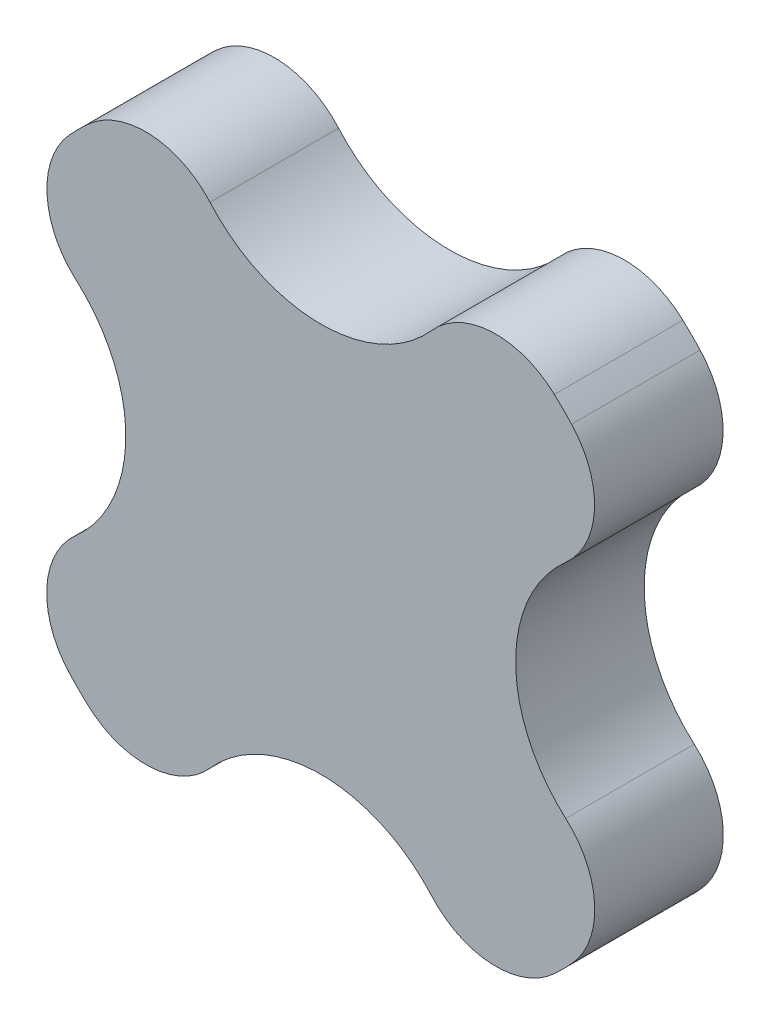
ISO-10303-21;
HEADER;
FILE_DESCRIPTION(('STEP AP214'),'2;1');
FILE_NAME('part.step','',(''),(''),'','','');
FILE_SCHEMA(('AUTOMOTIVE_DESIGN { 1 0 10303 214 1 1 1 1 }'));
ENDSEC;
DATA;
#1=APPLICATION_CONTEXT('core data for automotive mechanical design processes');
#2=APPLICATION_PROTOCOL_DEFINITION('international standard','automotive_design',2000,#1);
#3=PRODUCT_CONTEXT('',#1,'mechanical');
#4=PRODUCT('Part','Part','',(#3));
#5=PRODUCT_RELATED_PRODUCT_CATEGORY('part','',(#4));
#6=PRODUCT_DEFINITION_FORMATION('','',#4);
#7=PRODUCT_DEFINITION_CONTEXT('part definition',#1,'design');
#8=PRODUCT_DEFINITION('design','',#6,#7);
#9=PRODUCT_DEFINITION_SHAPE('','',#8);
#10=(LENGTH_UNIT() NAMED_UNIT(*) SI_UNIT(.MILLI.,.METRE.));
#11=(NAMED_UNIT(*) PLANE_ANGLE_UNIT() SI_UNIT($,.RADIAN.));
#12=(NAMED_UNIT(*) SI_UNIT($,.STERADIAN.) SOLID_ANGLE_UNIT());
#13=UNCERTAINTY_MEASURE_WITH_UNIT(LENGTH_MEASURE(1.E-05),#10,'distance_accuracy_value','');
#14=(GEOMETRIC_REPRESENTATION_CONTEXT(3) GLOBAL_UNCERTAINTY_ASSIGNED_CONTEXT((#13)) GLOBAL_UNIT_ASSIGNED_CONTEXT((#10,
#11,#12)) REPRESENTATION_CONTEXT('',''));
#15=CARTESIAN_POINT('',(0.,0.,0.));
#16=DIRECTION('',(0.,0.,1.));
#17=DIRECTION('',(1.,0.,0.));
#18=AXIS2_PLACEMENT_3D('',#15,#16,#17);
#19=CARTESIAN_POINT('',(-39.99999326808,0.023206827717899,15.));
#20=DIRECTION('',(0.,0.,-1.));
#21=DIRECTION('',(-1.,0.,0.));
#22=AXIS2_PLACEMENT_3D('',#19,#20,#21);
#23=CYLINDRICAL_SURFACE('',#22,17.252919273043);
#24=CARTESIAN_POINT('',(-39.99999326808,0.023206827717899,15.));
#25=DIRECTION('',(0.,0.,-1.));
#26=DIRECTION('',(0.,1.,0.));
#27=AXIS2_PLACEMENT_3D('',#24,#25,#26);
#28=CIRCLE('',#27,17.252919273043);
#29=CARTESIAN_POINT('',(-28.5757505394532,12.9518533740333,15.));
#30=VERTEX_POINT('',#29);
#31=CARTESIAN_POINT('',(-28.5907598713349,-12.9186870344931,15.));
#32=VERTEX_POINT('',#31);
#33=EDGE_CURVE('E165',#30,#32,#28,.T.);
#34=ORIENTED_EDGE('',*,*,#33,.F.);
#35=DIRECTION('',(0.,0.,-1.));
#36=VECTOR('',#35,1.);
#37=CARTESIAN_POINT('',(-28.5757505394532,12.9518533740333,15.));
#38=LINE('',#37,#36);
#39=CARTESIAN_POINT('',(-28.5757505394532,12.9518533740333,0.));
#40=VERTEX_POINT('',#39);
#41=EDGE_CURVE('E230',#30,#40,#38,.T.);
#42=ORIENTED_EDGE('',*,*,#41,.T.);
#43=CARTESIAN_POINT('',(-39.99999326808,0.023206827717899,0.));
#44=DIRECTION('',(0.,0.,-1.));
#45=DIRECTION('',(0.,1.,0.));
#46=AXIS2_PLACEMENT_3D('',#43,#44,#45);
#47=CIRCLE('',#46,17.252919273043);
#48=CARTESIAN_POINT('',(-28.5907598713349,-12.9186870344931,0.));
#49=VERTEX_POINT('',#48);
#50=EDGE_CURVE('E286',#40,#49,#47,.T.);
#51=ORIENTED_EDGE('',*,*,#50,.T.);
#52=DIRECTION('',(0.,0.,-1.));
#53=VECTOR('',#52,1.);
#54=CARTESIAN_POINT('',(-28.5907598713349,-12.9186870344931,15.));
#55=LINE('',#54,#53);
#56=EDGE_CURVE('E227',#49,#32,#55,.F.);
#57=ORIENTED_EDGE('',*,*,#56,.T.);
#58=EDGE_LOOP('',(#34,#42,#51,#57));
#59=FACE_BOUND('',#58,.T.);
#60=ADVANCED_FACE('F14',(#59),#23,.F.);
#61=CARTESIAN_POINT('',(0.,0.,15.));
#62=DIRECTION('',(0.,0.,-1.));
#63=DIRECTION('',(-1.,0.,0.));
#64=AXIS2_PLACEMENT_3D('',#61,#62,#63);
#65=CYLINDRICAL_SURFACE('',#64,40.0000000000413);
#66=CARTESIAN_POINT('',(0.,0.,15.));
#67=DIRECTION('',(0.,0.,1.));
#68=DIRECTION('',(1.,0.,0.));
#69=AXIS2_PLACEMENT_3D('',#66,#67,#68);
#70=CIRCLE('',#69,40.0000000000413);
#71=CARTESIAN_POINT('',(-29.3037742035903,-27.2266196474755,15.));
#72=VERTEX_POINT('',#71);
#73=CARTESIAN_POINT('',(-27.2266196474755,-29.3037742035903,15.));
#74=VERTEX_POINT('',#73);
#75=EDGE_CURVE('E308',#72,#74,#70,.T.);
#76=ORIENTED_EDGE('',*,*,#75,.F.);
#77=DIRECTION('',(0.,0.,-1.));
#78=VECTOR('',#77,1.);
#79=CARTESIAN_POINT('',(-29.3037742035904,-27.2266196474755,15.));
#80=LINE('',#79,#78);
#81=CARTESIAN_POINT('',(-29.3037742035903,-27.2266196474755,0.));
#82=VERTEX_POINT('',#81);
#83=EDGE_CURVE('E237',#72,#82,#80,.T.);
#84=ORIENTED_EDGE('',*,*,#83,.T.);
#85=CARTESIAN_POINT('',(0.,0.,0.));
#86=DIRECTION('',(0.,0.,1.));
#87=DIRECTION('',(1.,0.,0.));
#88=AXIS2_PLACEMENT_3D('',#85,#86,#87);
#89=CIRCLE('',#88,40.0000000000413);
#90=CARTESIAN_POINT('',(-27.2266196474755,-29.3037742035903,0.));
#91=VERTEX_POINT('',#90);
#92=EDGE_CURVE('E282',#82,#91,#89,.T.);
#93=ORIENTED_EDGE('',*,*,#92,.T.);
#94=DIRECTION('',(0.,0.,-1.));
#95=VECTOR('',#94,1.);
#96=CARTESIAN_POINT('',(-27.2266196474755,-29.3037742035903,15.));
#97=LINE('',#96,#95);
#98=EDGE_CURVE('E234',#91,#74,#97,.F.);
#99=ORIENTED_EDGE('',*,*,#98,.T.);
#100=EDGE_LOOP('',(#76,#84,#93,#99));
#101=FACE_BOUND('',#100,.T.);
#102=ADVANCED_FACE('F329',(#101),#65,.T.);
#103=CARTESIAN_POINT('',(0.0232068277178459,-39.99999326808,15.));
#104=DIRECTION('',(0.,0.,-1.));
#105=DIRECTION('',(-1.,0.,0.));
#106=AXIS2_PLACEMENT_3D('',#103,#104,#105);
#107=CYLINDRICAL_SURFACE('',#106,17.252919273043);
#108=CARTESIAN_POINT('',(0.0232068277178459,-39.99999326808,15.));
#109=DIRECTION('',(0.,0.,-1.));
#110=DIRECTION('',(1.,0.,0.));
#111=AXIS2_PLACEMENT_3D('',#108,#109,#110);
#112=CIRCLE('',#111,17.252919273043);
#113=CARTESIAN_POINT('',(-12.9186870344931,-28.5907598713349,15.));
#114=VERTEX_POINT('',#113);
#115=CARTESIAN_POINT('',(12.9518533740333,-28.5757505394532,15.));
#116=VERTEX_POINT('',#115);
#117=EDGE_CURVE('E304',#114,#116,#112,.T.);
#118=ORIENTED_EDGE('',*,*,#117,.F.);
#119=DIRECTION('',(0.,0.,-1.));
#120=VECTOR('',#119,1.);
#121=CARTESIAN_POINT('',(-12.9186870344931,-28.5907598713349,15.));
#122=LINE('',#121,#120);
#123=CARTESIAN_POINT('',(-12.9186870344931,-28.5907598713349,0.));
#124=VERTEX_POINT('',#123);
#125=EDGE_CURVE('E244',#114,#124,#122,.T.);
#126=ORIENTED_EDGE('',*,*,#125,.T.);
#127=CARTESIAN_POINT('',(0.0232068277178459,-39.99999326808,0.));
#128=DIRECTION('',(0.,0.,-1.));
#129=DIRECTION('',(1.,0.,0.));
#130=AXIS2_PLACEMENT_3D('',#127,#128,#129);
#131=CIRCLE('',#130,17.252919273043);
#132=CARTESIAN_POINT('',(12.9518533740333,-28.5757505394532,0.));
#133=VERTEX_POINT('',#132);
#134=EDGE_CURVE('E276',#124,#133,#131,.T.);
#135=ORIENTED_EDGE('',*,*,#134,.T.);
#136=DIRECTION('',(0.,0.,-1.));
#137=VECTOR('',#136,1.);
#138=CARTESIAN_POINT('',(12.9518533740333,-28.5757505394532,15.));
#139=LINE('',#138,#137);
#140=EDGE_CURVE('E241',#133,#116,#139,.F.);
#141=ORIENTED_EDGE('',*,*,#140,.T.);
#142=EDGE_LOOP('',(#118,#126,#135,#141));
#143=FACE_BOUND('',#142,.T.);
#144=ADVANCED_FACE('F339',(#143),#107,.F.);
#145=CARTESIAN_POINT('',(0.,0.,15.));
#146=DIRECTION('',(0.,0.,-1.));
#147=DIRECTION('',(-1.,0.,0.));
#148=AXIS2_PLACEMENT_3D('',#145,#146,#147);
#149=CYLINDRICAL_SURFACE('',#148,40.0000000000413);
#150=CARTESIAN_POINT('',(0.,0.,15.));
#151=DIRECTION('',(0.,0.,1.));
#152=DIRECTION('',(1.,0.,0.));
#153=AXIS2_PLACEMENT_3D('',#150,#151,#152);
#154=CIRCLE('',#153,40.0000000000413);
#155=CARTESIAN_POINT('',(27.2606036948709,-29.2721623081469,15.));
#156=VERTEX_POINT('',#155);
#157=CARTESIAN_POINT('',(29.3037742035903,-27.2266196474755,15.));
#158=VERTEX_POINT('',#157);
#159=EDGE_CURVE('E300',#156,#158,#154,.T.);
#160=ORIENTED_EDGE('',*,*,#159,.F.);
#161=DIRECTION('',(0.,0.,-1.));
#162=VECTOR('',#161,1.);
#163=CARTESIAN_POINT('',(27.2606036948709,-29.2721623081469,15.));
#164=LINE('',#163,#162);
#165=CARTESIAN_POINT('',(27.2606036948709,-29.2721623081469,0.));
#166=VERTEX_POINT('',#165);
#167=EDGE_CURVE('E251',#156,#166,#164,.T.);
#168=ORIENTED_EDGE('',*,*,#167,.T.);
#169=CARTESIAN_POINT('',(0.,0.,0.));
#170=DIRECTION('',(0.,0.,1.));
#171=DIRECTION('',(1.,0.,0.));
#172=AXIS2_PLACEMENT_3D('',#169,#170,#171);
#173=CIRCLE('',#172,40.0000000000413);
#174=CARTESIAN_POINT('',(29.3037742035903,-27.2266196474755,0.));
#175=VERTEX_POINT('',#174);
#176=EDGE_CURVE('E272',#166,#175,#173,.T.);
#177=ORIENTED_EDGE('',*,*,#176,.T.);
#178=DIRECTION('',(0.,0.,-1.));
#179=VECTOR('',#178,1.);
#180=CARTESIAN_POINT('',(29.3037742035903,-27.2266196474755,15.));
#181=LINE('',#180,#179);
#182=EDGE_CURVE('E248',#175,#158,#181,.F.);
#183=ORIENTED_EDGE('',*,*,#182,.T.);
#184=EDGE_LOOP('',(#160,#168,#177,#183));
#185=FACE_BOUND('',#184,.T.);
#186=ADVANCED_FACE('F347',(#185),#149,.T.);
#187=CARTESIAN_POINT('',(39.99999326808,0.0232068277177949,15.));
#188=DIRECTION('',(0.,0.,-1.));
#189=DIRECTION('',(-1.,0.,0.));
#190=AXIS2_PLACEMENT_3D('',#187,#188,#189);
#191=CYLINDRICAL_SURFACE('',#190,17.252919273043);
#192=CARTESIAN_POINT('',(39.99999326808,0.0232068277177949,0.));
#193=DIRECTION('',(0.,0.,-1.));
#194=DIRECTION('',(0.,1.,0.));
#195=AXIS2_PLACEMENT_3D('',#192,#193,#194);
#196=CIRCLE('',#195,17.252919273043);
#197=CARTESIAN_POINT('',(28.5907598713349,-12.9186870344931,0.));
#198=VERTEX_POINT('',#197);
#199=CARTESIAN_POINT('',(28.5757505394532,12.9518533740332,0.));
#200=VERTEX_POINT('',#199);
#201=EDGE_CURVE('E167',#198,#200,#196,.T.);
#202=ORIENTED_EDGE('',*,*,#201,.T.);
#203=DIRECTION('',(0.,0.,-1.));
#204=VECTOR('',#203,1.);
#205=CARTESIAN_POINT('',(28.5757505394532,12.9518533740332,15.));
#206=LINE('',#205,#204);
#207=CARTESIAN_POINT('',(28.5757505394532,12.9518533740332,15.));
#208=VERTEX_POINT('',#207);
#209=EDGE_CURVE('E9',#200,#208,#206,.F.);
#210=ORIENTED_EDGE('',*,*,#209,.T.);
#211=CARTESIAN_POINT('',(39.99999326808,0.0232068277177949,15.));
#212=DIRECTION('',(0.,0.,-1.));
#213=DIRECTION('',(0.,1.,0.));
#214=AXIS2_PLACEMENT_3D('',#211,#212,#213);
#215=CIRCLE('',#214,17.252919273043);
#216=CARTESIAN_POINT('',(28.5907598713349,-12.9186870344931,15.));
#217=VERTEX_POINT('',#216);
#218=EDGE_CURVE('E266',#217,#208,#215,.T.);
#219=ORIENTED_EDGE('',*,*,#218,.F.);
#220=DIRECTION('',(0.,0.,-1.));
#221=VECTOR('',#220,1.);
#222=CARTESIAN_POINT('',(28.5907598713349,-12.9186870344931,15.));
#223=LINE('',#222,#221);
#224=EDGE_CURVE('E23',#217,#198,#223,.T.);
#225=ORIENTED_EDGE('',*,*,#224,.T.);
#226=EDGE_LOOP('',(#202,#210,#219,#225));
#227=FACE_BOUND('',#226,.T.);
#228=ADVANCED_FACE('F263',(#227),#191,.F.);
#229=CARTESIAN_POINT('',(0.,0.,15.));
#230=DIRECTION('',(0.,0.,-1.));
#231=DIRECTION('',(-1.,0.,0.));
#232=AXIS2_PLACEMENT_3D('',#229,#230,#231);
#233=CYLINDRICAL_SURFACE('',#232,40.0000000000413);
#234=CARTESIAN_POINT('',(0.,0.,0.));
#235=DIRECTION('',(0.,0.,1.));
#236=DIRECTION('',(1.,0.,0.));
#237=AXIS2_PLACEMENT_3D('',#234,#235,#236);
#238=CIRCLE('',#237,40.0000000000413);
#239=CARTESIAN_POINT('',(29.2721623081469,27.2606036948708,0.));
#240=VERTEX_POINT('',#239);
#241=CARTESIAN_POINT('',(27.2606036948709,29.2721623081469,0.));
#242=VERTEX_POINT('',#241);
#243=EDGE_CURVE('E158',#240,#242,#238,.T.);
#244=ORIENTED_EDGE('',*,*,#243,.T.);
#245=DIRECTION('',(0.,0.,-1.));
#246=VECTOR('',#245,1.);
#247=CARTESIAN_POINT('',(27.2606036948709,29.2721623081469,15.));
#248=LINE('',#247,#246);
#249=CARTESIAN_POINT('',(27.2606036948709,29.2721623081469,15.));
#250=VERTEX_POINT('',#249);
#251=EDGE_CURVE('E134',#242,#250,#248,.F.);
#252=ORIENTED_EDGE('',*,*,#251,.T.);
#253=CARTESIAN_POINT('',(0.,0.,15.));
#254=DIRECTION('',(0.,0.,1.));
#255=DIRECTION('',(1.,0.,0.));
#256=AXIS2_PLACEMENT_3D('',#253,#254,#255);
#257=CIRCLE('',#256,40.0000000000413);
#258=CARTESIAN_POINT('',(29.2721623081469,27.2606036948708,15.));
#259=VERTEX_POINT('',#258);
#260=EDGE_CURVE('E294',#259,#250,#257,.T.);
#261=ORIENTED_EDGE('',*,*,#260,.F.);
#262=DIRECTION('',(0.,0.,-1.));
#263=VECTOR('',#262,1.);
#264=CARTESIAN_POINT('',(29.2721623081469,27.2606036948708,15.));
#265=LINE('',#264,#263);
#266=EDGE_CURVE('E140',#259,#240,#265,.T.);
#267=ORIENTED_EDGE('',*,*,#266,.T.);
#268=EDGE_LOOP('',(#244,#252,#261,#267));
#269=FACE_BOUND('',#268,.T.);
#270=ADVANCED_FACE('F451',(#269),#233,.T.);
#271=CARTESIAN_POINT('',(0.0232068277178459,39.99999326808,15.));
#272=DIRECTION('',(0.,0.,-1.));
#273=DIRECTION('',(-1.,0.,0.));
#274=AXIS2_PLACEMENT_3D('',#271,#272,#273);
#275=CYLINDRICAL_SURFACE('',#274,17.252919273043);
#276=CARTESIAN_POINT('',(0.0232068277178459,39.99999326808,15.));
#277=DIRECTION('',(0.,0.,-1.));
#278=DIRECTION('',(1.,0.,0.));
#279=AXIS2_PLACEMENT_3D('',#276,#277,#278);
#280=CIRCLE('',#279,17.252919273043);
#281=CARTESIAN_POINT('',(12.9518533740333,28.5757505394532,15.));
#282=VERTEX_POINT('',#281);
#283=CARTESIAN_POINT('',(-12.9186870344931,28.5907598713349,15.));
#284=VERTEX_POINT('',#283);
#285=EDGE_CURVE('E149',#282,#284,#280,.T.);
#286=ORIENTED_EDGE('',*,*,#285,.F.);
#287=DIRECTION('',(0.,0.,-1.));
#288=VECTOR('',#287,1.);
#289=CARTESIAN_POINT('',(12.9518533740333,28.5757505394532,15.));
#290=LINE('',#289,#288);
#291=CARTESIAN_POINT('',(12.9518533740333,28.5757505394532,0.));
#292=VERTEX_POINT('',#291);
#293=EDGE_CURVE('E133',#282,#292,#290,.T.);
#294=ORIENTED_EDGE('',*,*,#293,.T.);
#295=CARTESIAN_POINT('',(0.0232068277178459,39.99999326808,0.));
#296=DIRECTION('',(0.,0.,-1.));
#297=DIRECTION('',(1.,0.,0.));
#298=AXIS2_PLACEMENT_3D('',#295,#296,#297);
#299=CIRCLE('',#298,17.252919273043);
#300=CARTESIAN_POINT('',(-12.9186870344931,28.5907598713349,0.));
#301=VERTEX_POINT('',#300);
#302=EDGE_CURVE('E147',#292,#301,#299,.T.);
#303=ORIENTED_EDGE('',*,*,#302,.T.);
#304=DIRECTION('',(0.,0.,-1.));
#305=VECTOR('',#304,1.);
#306=CARTESIAN_POINT('',(-12.9186870344931,28.5907598713349,15.));
#307=LINE('',#306,#305);
#308=EDGE_CURVE('E152',#301,#284,#307,.F.);
#309=ORIENTED_EDGE('',*,*,#308,.T.);
#310=EDGE_LOOP('',(#286,#294,#303,#309));
#311=FACE_BOUND('',#310,.T.);
#312=ADVANCED_FACE('F146',(#311),#275,.F.);
#313=CARTESIAN_POINT('',(0.,0.,15.));
#314=DIRECTION('',(0.,0.,-1.));
#315=DIRECTION('',(-1.,0.,0.));
#316=AXIS2_PLACEMENT_3D('',#313,#314,#315);
#317=CYLINDRICAL_SURFACE('',#316,40.0000000000413);
#318=CARTESIAN_POINT('',(0.,0.,15.));
#319=DIRECTION('',(0.,0.,1.));
#320=DIRECTION('',(1.,0.,0.));
#321=AXIS2_PLACEMENT_3D('',#318,#319,#320);
#322=CIRCLE('',#321,40.0000000000413);
#323=CARTESIAN_POINT('',(-27.2266196474755,29.3037742035903,15.));
#324=VERTEX_POINT('',#323);
#325=CARTESIAN_POINT('',(-29.2721623081468,27.260603694871,15.));
#326=VERTEX_POINT('',#325);
#327=EDGE_CURVE('E172',#324,#326,#322,.T.);
#328=ORIENTED_EDGE('',*,*,#327,.F.);
#329=DIRECTION('',(0.,0.,-1.));
#330=VECTOR('',#329,1.);
#331=CARTESIAN_POINT('',(-27.2266196474755,29.3037742035903,15.));
#332=LINE('',#331,#330);
#333=CARTESIAN_POINT('',(-27.2266196474755,29.3037742035903,0.));
#334=VERTEX_POINT('',#333);
#335=EDGE_CURVE('E223',#324,#334,#332,.T.);
#336=ORIENTED_EDGE('',*,*,#335,.T.);
#337=CARTESIAN_POINT('',(0.,0.,0.));
#338=DIRECTION('',(0.,0.,1.));
#339=DIRECTION('',(1.,0.,0.));
#340=AXIS2_PLACEMENT_3D('',#337,#338,#339);
#341=CIRCLE('',#340,40.0000000000413);
#342=CARTESIAN_POINT('',(-29.2721623081468,27.260603694871,0.));
#343=VERTEX_POINT('',#342);
#344=EDGE_CURVE('E157',#334,#343,#341,.T.);
#345=ORIENTED_EDGE('',*,*,#344,.T.);
#346=DIRECTION('',(0.,0.,-1.));
#347=VECTOR('',#346,1.);
#348=CARTESIAN_POINT('',(-29.2721623081468,27.260603694871,15.));
#349=LINE('',#348,#347);
#350=EDGE_CURVE('E30',#343,#326,#349,.F.);
#351=ORIENTED_EDGE('',*,*,#350,.T.);
#352=EDGE_LOOP('',(#328,#336,#345,#351));
#353=FACE_BOUND('',#352,.T.);
#354=ADVANCED_FACE('F418',(#353),#317,.T.);
#355=CARTESIAN_POINT('',(-19.99999663404,0.0116034138589495,15.));
#356=DIRECTION('',(0.,0.,-1.));
#357=DIRECTION('',(-1.,0.,0.));
#358=AXIS2_PLACEMENT_3D('',#355,#356,#357);
#359=PLANE('',#358);
#360=ORIENTED_EDGE('',*,*,#260,.T.);
#361=CARTESIAN_POINT('',(20.4454527711602,21.9541217311176,15.));
#362=DIRECTION('',(0.,0.,-1.));
#363=DIRECTION('',(-1.,0.,0.));
#364=AXIS2_PLACEMENT_3D('',#361,#362,#363);
#365=CIRCLE('',#364,10.);
#366=EDGE_CURVE('E218',#250,#282,#365,.F.);
#367=ORIENTED_EDGE('',*,*,#366,.T.);
#368=ORIENTED_EDGE('',*,*,#285,.T.);
#369=CARTESIAN_POINT('',(-20.4199647356136,21.9778306527003,15.));
#370=DIRECTION('',(0.,0.,-1.));
#371=DIRECTION('',(-1.,0.,0.));
#372=AXIS2_PLACEMENT_3D('',#369,#370,#371);
#373=CIRCLE('',#372,10.);
#374=EDGE_CURVE('E37',#284,#324,#373,.F.);
#375=ORIENTED_EDGE('',*,*,#374,.T.);
#376=ORIENTED_EDGE('',*,*,#327,.T.);
#377=CARTESIAN_POINT('',(-21.9541217311176,20.4454527711602,15.));
#378=DIRECTION('',(0.,0.,-1.));
#379=DIRECTION('',(-1.,0.,0.));
#380=AXIS2_PLACEMENT_3D('',#377,#378,#379);
#381=CIRCLE('',#380,10.);
#382=EDGE_CURVE('E213',#326,#30,#381,.F.);
#383=ORIENTED_EDGE('',*,*,#382,.T.);
#384=ORIENTED_EDGE('',*,*,#33,.T.);
#385=CARTESIAN_POINT('',(-21.9778306527003,-20.4199647356136,15.));
#386=DIRECTION('',(0.,0.,-1.));
#387=DIRECTION('',(-1.,0.,0.));
#388=AXIS2_PLACEMENT_3D('',#385,#386,#387);
#389=CIRCLE('',#388,10.);
#390=EDGE_CURVE('E210',#32,#72,#389,.F.);
#391=ORIENTED_EDGE('',*,*,#390,.T.);
#392=ORIENTED_EDGE('',*,*,#75,.T.);
#393=CARTESIAN_POINT('',(-20.4199647356136,-21.9778306527003,15.));
#394=DIRECTION('',(0.,0.,-1.));
#395=DIRECTION('',(-1.,0.,0.));
#396=AXIS2_PLACEMENT_3D('',#393,#394,#395);
#397=CIRCLE('',#396,10.);
#398=EDGE_CURVE('E207',#74,#114,#397,.F.);
#399=ORIENTED_EDGE('',*,*,#398,.T.);
#400=ORIENTED_EDGE('',*,*,#117,.T.);
#401=CARTESIAN_POINT('',(20.4454527711602,-21.9541217311176,15.));
#402=DIRECTION('',(0.,0.,-1.));
#403=DIRECTION('',(-1.,0.,0.));
#404=AXIS2_PLACEMENT_3D('',#401,#402,#403);
#405=CIRCLE('',#404,10.);
#406=EDGE_CURVE('E204',#116,#156,#405,.F.);
#407=ORIENTED_EDGE('',*,*,#406,.T.);
#408=ORIENTED_EDGE('',*,*,#159,.T.);
#409=CARTESIAN_POINT('',(21.9778306527003,-20.4199647356137,15.));
#410=DIRECTION('',(0.,0.,-1.));
#411=DIRECTION('',(-1.,0.,0.));
#412=AXIS2_PLACEMENT_3D('',#409,#410,#411);
#413=CIRCLE('',#412,10.);
#414=EDGE_CURVE('E198',#158,#217,#413,.F.);
#415=ORIENTED_EDGE('',*,*,#414,.T.);
#416=ORIENTED_EDGE('',*,*,#218,.T.);
#417=CARTESIAN_POINT('',(21.9541217311177,20.4454527711601,15.));
#418=DIRECTION('',(0.,0.,-1.));
#419=DIRECTION('',(-1.,0.,0.));
#420=AXIS2_PLACEMENT_3D('',#417,#418,#419);
#421=CIRCLE('',#420,10.);
#422=EDGE_CURVE('E201',#208,#259,#421,.F.);
#423=ORIENTED_EDGE('',*,*,#422,.T.);
#424=EDGE_LOOP('',(#360,#367,#368,#375,#376,#383,#384,#391,#392,#399,#400,#407,#408,#415,#416,#423));
#425=FACE_BOUND('',#424,.T.);
#426=ADVANCED_FACE('F318',(#425),#359,.F.);
#427=CARTESIAN_POINT('',(-19.99999663404,0.0116034138589495,0.));
#428=DIRECTION('',(0.,0.,-1.));
#429=DIRECTION('',(-1.,0.,0.));
#430=AXIS2_PLACEMENT_3D('',#427,#428,#429);
#431=PLANE('',#430);
#432=ORIENTED_EDGE('',*,*,#302,.F.);
#433=CARTESIAN_POINT('',(20.4454527711602,21.9541217311176,0.));
#434=DIRECTION('',(0.,0.,-1.));
#435=DIRECTION('',(-1.,0.,0.));
#436=AXIS2_PLACEMENT_3D('',#433,#434,#435);
#437=CIRCLE('',#436,10.);
#438=EDGE_CURVE('E129',#292,#242,#437,.T.);
#439=ORIENTED_EDGE('',*,*,#438,.T.);
#440=ORIENTED_EDGE('',*,*,#243,.F.);
#441=CARTESIAN_POINT('',(21.9541217311177,20.4454527711601,0.));
#442=DIRECTION('',(0.,0.,-1.));
#443=DIRECTION('',(-1.,0.,0.));
#444=AXIS2_PLACEMENT_3D('',#441,#442,#443);
#445=CIRCLE('',#444,10.);
#446=EDGE_CURVE('E176',#240,#200,#445,.T.);
#447=ORIENTED_EDGE('',*,*,#446,.T.);
#448=ORIENTED_EDGE('',*,*,#201,.F.);
#449=CARTESIAN_POINT('',(21.9778306527003,-20.4199647356137,0.));
#450=DIRECTION('',(0.,0.,-1.));
#451=DIRECTION('',(-1.,0.,0.));
#452=AXIS2_PLACEMENT_3D('',#449,#450,#451);
#453=CIRCLE('',#452,10.);
#454=EDGE_CURVE('E151',#198,#175,#453,.T.);
#455=ORIENTED_EDGE('',*,*,#454,.T.);
#456=ORIENTED_EDGE('',*,*,#176,.F.);
#457=CARTESIAN_POINT('',(20.4454527711602,-21.9541217311176,0.));
#458=DIRECTION('',(0.,0.,-1.));
#459=DIRECTION('',(-1.,0.,0.));
#460=AXIS2_PLACEMENT_3D('',#457,#458,#459);
#461=CIRCLE('',#460,10.);
#462=EDGE_CURVE('E179',#166,#133,#461,.T.);
#463=ORIENTED_EDGE('',*,*,#462,.T.);
#464=ORIENTED_EDGE('',*,*,#134,.F.);
#465=CARTESIAN_POINT('',(-20.4199647356136,-21.9778306527003,0.));
#466=DIRECTION('',(0.,0.,-1.));
#467=DIRECTION('',(-1.,0.,0.));
#468=AXIS2_PLACEMENT_3D('',#465,#466,#467);
#469=CIRCLE('',#468,10.);
#470=EDGE_CURVE('E182',#124,#91,#469,.T.);
#471=ORIENTED_EDGE('',*,*,#470,.T.);
#472=ORIENTED_EDGE('',*,*,#92,.F.);
#473=CARTESIAN_POINT('',(-21.9778306527003,-20.4199647356136,0.));
#474=DIRECTION('',(0.,0.,-1.));
#475=DIRECTION('',(-1.,0.,0.));
#476=AXIS2_PLACEMENT_3D('',#473,#474,#475);
#477=CIRCLE('',#476,10.);
#478=EDGE_CURVE('E185',#82,#49,#477,.T.);
#479=ORIENTED_EDGE('',*,*,#478,.T.);
#480=ORIENTED_EDGE('',*,*,#50,.F.);
#481=CARTESIAN_POINT('',(-21.9541217311176,20.4454527711602,0.));
#482=DIRECTION('',(0.,0.,-1.));
#483=DIRECTION('',(-1.,0.,0.));
#484=AXIS2_PLACEMENT_3D('',#481,#482,#483);
#485=CIRCLE('',#484,10.);
#486=EDGE_CURVE('E188',#40,#343,#485,.T.);
#487=ORIENTED_EDGE('',*,*,#486,.T.);
#488=ORIENTED_EDGE('',*,*,#344,.F.);
#489=CARTESIAN_POINT('',(-20.4199647356136,21.9778306527003,0.));
#490=DIRECTION('',(0.,0.,-1.));
#491=DIRECTION('',(-1.,0.,0.));
#492=AXIS2_PLACEMENT_3D('',#489,#490,#491);
#493=CIRCLE('',#492,10.);
#494=EDGE_CURVE('E141',#334,#301,#493,.T.);
#495=ORIENTED_EDGE('',*,*,#494,.T.);
#496=EDGE_LOOP('',(#432,#439,#440,#447,#448,#455,#456,#463,#464,#471,#472,#479,#480,#487,#488,#495));
#497=FACE_BOUND('',#496,.T.);
#498=ADVANCED_FACE('F154',(#497),#431,.T.);
#499=CARTESIAN_POINT('',(20.4454527711602,21.9541217311176,15.));
#500=DIRECTION('',(0.,0.,1.));
#501=DIRECTION('',(1.,0.,0.));
#502=AXIS2_PLACEMENT_3D('',#499,#500,#501);
#503=CYLINDRICAL_SURFACE('',#502,10.);
#504=ORIENTED_EDGE('',*,*,#366,.F.);
#505=ORIENTED_EDGE('',*,*,#251,.F.);
#506=ORIENTED_EDGE('',*,*,#438,.F.);
#507=ORIENTED_EDGE('',*,*,#293,.F.);
#508=EDGE_LOOP('',(#504,#505,#506,#507));
#509=FACE_BOUND('',#508,.T.);
#510=ADVANCED_FACE('F132',(#509),#503,.T.);
#511=CARTESIAN_POINT('',(-20.4199647356136,21.9778306527003,15.));
#512=DIRECTION('',(0.,0.,1.));
#513=DIRECTION('',(1.,0.,0.));
#514=AXIS2_PLACEMENT_3D('',#511,#512,#513);
#515=CYLINDRICAL_SURFACE('',#514,10.);
#516=ORIENTED_EDGE('',*,*,#374,.F.);
#517=ORIENTED_EDGE('',*,*,#308,.F.);
#518=ORIENTED_EDGE('',*,*,#494,.F.);
#519=ORIENTED_EDGE('',*,*,#335,.F.);
#520=EDGE_LOOP('',(#516,#517,#518,#519));
#521=FACE_BOUND('',#520,.T.);
#522=ADVANCED_FACE('F366',(#521),#515,.T.);
#523=CARTESIAN_POINT('',(-21.9541217311176,20.4454527711602,15.));
#524=DIRECTION('',(0.,0.,1.));
#525=DIRECTION('',(1.,0.,0.));
#526=AXIS2_PLACEMENT_3D('',#523,#524,#525);
#527=CYLINDRICAL_SURFACE('',#526,10.);
#528=ORIENTED_EDGE('',*,*,#382,.F.);
#529=ORIENTED_EDGE('',*,*,#350,.F.);
#530=ORIENTED_EDGE('',*,*,#486,.F.);
#531=ORIENTED_EDGE('',*,*,#41,.F.);
#532=EDGE_LOOP('',(#528,#529,#530,#531));
#533=FACE_BOUND('',#532,.T.);
#534=ADVANCED_FACE('F369',(#533),#527,.T.);
#535=CARTESIAN_POINT('',(-21.9778306527003,-20.4199647356136,15.));
#536=DIRECTION('',(0.,0.,1.));
#537=DIRECTION('',(1.,0.,0.));
#538=AXIS2_PLACEMENT_3D('',#535,#536,#537);
#539=CYLINDRICAL_SURFACE('',#538,10.);
#540=ORIENTED_EDGE('',*,*,#390,.F.);
#541=ORIENTED_EDGE('',*,*,#56,.F.);
#542=ORIENTED_EDGE('',*,*,#478,.F.);
#543=ORIENTED_EDGE('',*,*,#83,.F.);
#544=EDGE_LOOP('',(#540,#541,#542,#543));
#545=FACE_BOUND('',#544,.T.);
#546=ADVANCED_FACE('F326',(#545),#539,.T.);
#547=CARTESIAN_POINT('',(-20.4199647356136,-21.9778306527003,15.));
#548=DIRECTION('',(0.,0.,1.));
#549=DIRECTION('',(1.,0.,0.));
#550=AXIS2_PLACEMENT_3D('',#547,#548,#549);
#551=CYLINDRICAL_SURFACE('',#550,10.);
#552=ORIENTED_EDGE('',*,*,#398,.F.);
#553=ORIENTED_EDGE('',*,*,#98,.F.);
#554=ORIENTED_EDGE('',*,*,#470,.F.);
#555=ORIENTED_EDGE('',*,*,#125,.F.);
#556=EDGE_LOOP('',(#552,#553,#554,#555));
#557=FACE_BOUND('',#556,.T.);
#558=ADVANCED_FACE('F336',(#557),#551,.T.);
#559=CARTESIAN_POINT('',(20.4454527711602,-21.9541217311176,15.));
#560=DIRECTION('',(0.,0.,1.));
#561=DIRECTION('',(1.,0.,0.));
#562=AXIS2_PLACEMENT_3D('',#559,#560,#561);
#563=CYLINDRICAL_SURFACE('',#562,10.);
#564=ORIENTED_EDGE('',*,*,#406,.F.);
#565=ORIENTED_EDGE('',*,*,#140,.F.);
#566=ORIENTED_EDGE('',*,*,#462,.F.);
#567=ORIENTED_EDGE('',*,*,#167,.F.);
#568=EDGE_LOOP('',(#564,#565,#566,#567));
#569=FACE_BOUND('',#568,.T.);
#570=ADVANCED_FACE('F345',(#569),#563,.T.);
#571=CARTESIAN_POINT('',(21.9541217311177,20.4454527711601,15.));
#572=DIRECTION('',(0.,0.,1.));
#573=DIRECTION('',(1.,0.,0.));
#574=AXIS2_PLACEMENT_3D('',#571,#572,#573);
#575=CYLINDRICAL_SURFACE('',#574,10.);
#576=ORIENTED_EDGE('',*,*,#422,.F.);
#577=ORIENTED_EDGE('',*,*,#209,.F.);
#578=ORIENTED_EDGE('',*,*,#446,.F.);
#579=ORIENTED_EDGE('',*,*,#266,.F.);
#580=EDGE_LOOP('',(#576,#577,#578,#579));
#581=FACE_BOUND('',#580,.T.);
#582=ADVANCED_FACE('F350',(#581),#575,.T.);
#583=CARTESIAN_POINT('',(21.9778306527003,-20.4199647356137,15.));
#584=DIRECTION('',(0.,0.,1.));
#585=DIRECTION('',(1.,0.,0.));
#586=AXIS2_PLACEMENT_3D('',#583,#584,#585);
#587=CYLINDRICAL_SURFACE('',#586,10.);
#588=ORIENTED_EDGE('',*,*,#414,.F.);
#589=ORIENTED_EDGE('',*,*,#182,.F.);
#590=ORIENTED_EDGE('',*,*,#454,.F.);
#591=ORIENTED_EDGE('',*,*,#224,.F.);
#592=EDGE_LOOP('',(#588,#589,#590,#591));
#593=FACE_BOUND('',#592,.T.);
#594=ADVANCED_FACE('F16',(#593),#587,.T.);
#595=CLOSED_SHELL('',(#60,#102,#144,#186,#228,#270,#312,#354,#426,#498,#510,#522,#534,#546,#558,
#570,#582,#594));
#596=MANIFOLD_SOLID_BREP('B1',#595);
#597=ADVANCED_BREP_SHAPE_REPRESENTATION('',(#18,#596),#14);
#598=SHAPE_DEFINITION_REPRESENTATION(#9,#597);
ENDSEC;
END-ISO-10303-21;
